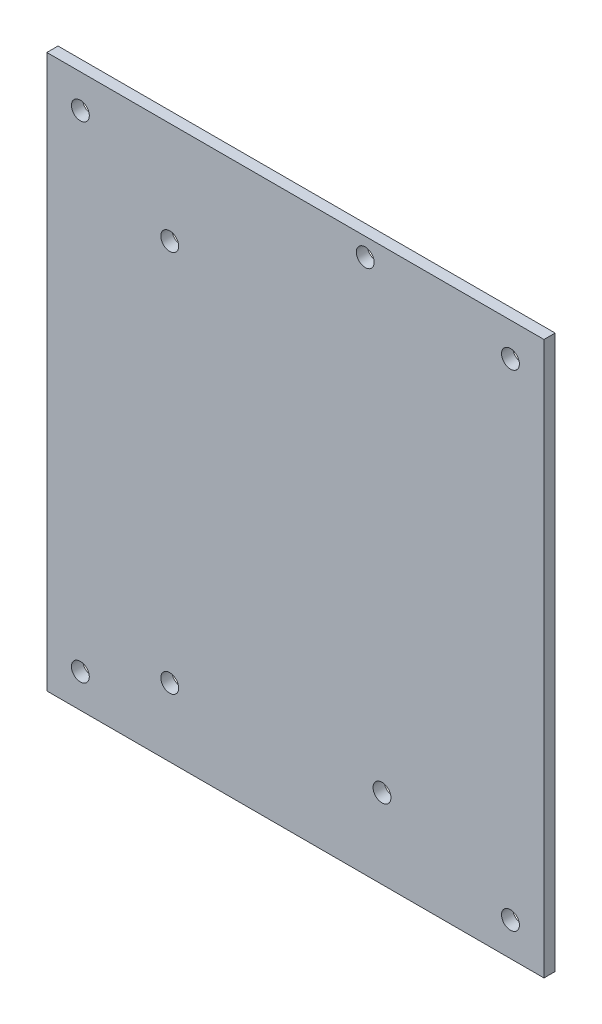
ISO-10303-21;
HEADER;
FILE_DESCRIPTION(('STEP AP214'),'2;1');
FILE_NAME('part.step','',(''),(''),'','','');
FILE_SCHEMA(('AUTOMOTIVE_DESIGN { 1 0 10303 214 1 1 1 1 }'));
ENDSEC;
DATA;
#1=APPLICATION_CONTEXT('core data for automotive mechanical design processes');
#2=APPLICATION_PROTOCOL_DEFINITION('international standard','automotive_design',2000,#1);
#3=PRODUCT_CONTEXT('',#1,'mechanical');
#4=PRODUCT('Part','Part','',(#3));
#5=PRODUCT_RELATED_PRODUCT_CATEGORY('part','',(#4));
#6=PRODUCT_DEFINITION_FORMATION('','',#4);
#7=PRODUCT_DEFINITION_CONTEXT('part definition',#1,'design');
#8=PRODUCT_DEFINITION('design','',#6,#7);
#9=PRODUCT_DEFINITION_SHAPE('','',#8);
#10=(LENGTH_UNIT() NAMED_UNIT(*) SI_UNIT(.MILLI.,.METRE.));
#11=(NAMED_UNIT(*) PLANE_ANGLE_UNIT() SI_UNIT($,.RADIAN.));
#12=(NAMED_UNIT(*) SI_UNIT($,.STERADIAN.) SOLID_ANGLE_UNIT());
#13=UNCERTAINTY_MEASURE_WITH_UNIT(LENGTH_MEASURE(1.E-05),#10,'distance_accuracy_value','');
#14=(GEOMETRIC_REPRESENTATION_CONTEXT(3) GLOBAL_UNCERTAINTY_ASSIGNED_CONTEXT((#13)) GLOBAL_UNIT_ASSIGNED_CONTEXT((#10,
#11,#12)) REPRESENTATION_CONTEXT('',''));
#15=CARTESIAN_POINT('',(0.,0.,0.));
#16=DIRECTION('',(0.,0.,1.));
#17=DIRECTION('',(1.,0.,0.));
#18=AXIS2_PLACEMENT_3D('',#15,#16,#17);
#19=CARTESIAN_POINT('',(-37.8802119802,-33.0379075483988,2.));
#20=DIRECTION('',(1.,0.,0.));
#21=DIRECTION('',(0.,0.,-1.));
#22=AXIS2_PLACEMENT_3D('',#19,#20,#21);
#23=PLANE('',#22);
#24=DIRECTION('',(0.,-1.,0.));
#25=VECTOR('',#24,1.);
#26=CARTESIAN_POINT('',(-37.8802119802,-33.0379075483988,0.));
#27=LINE('',#26,#25);
#28=CARTESIAN_POINT('',(-37.8802119802,65.9620924516012,0.));
#29=VERTEX_POINT('',#28);
#30=CARTESIAN_POINT('',(-37.8802119802,-33.0379075483988,0.));
#31=VERTEX_POINT('',#30);
#32=EDGE_CURVE('E96',#29,#31,#27,.T.);
#33=ORIENTED_EDGE('',*,*,#32,.T.);
#34=DIRECTION('',(0.,0.,-1.));
#35=VECTOR('',#34,1.);
#36=CARTESIAN_POINT('',(-37.8802119802,-33.0379075483988,2.));
#37=LINE('',#36,#35);
#38=CARTESIAN_POINT('',(-37.8802119802,-33.0379075483988,2.));
#39=VERTEX_POINT('',#38);
#40=EDGE_CURVE('E11',#39,#31,#37,.T.);
#41=ORIENTED_EDGE('',*,*,#40,.F.);
#42=DIRECTION('',(0.,-1.,0.));
#43=VECTOR('',#42,1.);
#44=CARTESIAN_POINT('',(-37.8802119802,-33.0379075483988,2.));
#45=LINE('',#44,#43);
#46=CARTESIAN_POINT('',(-37.8802119802,65.9620924516012,2.));
#47=VERTEX_POINT('',#46);
#48=EDGE_CURVE('E84',#47,#39,#45,.T.);
#49=ORIENTED_EDGE('',*,*,#48,.F.);
#50=DIRECTION('',(0.,0.,-1.));
#51=VECTOR('',#50,1.);
#52=CARTESIAN_POINT('',(-37.8802119802,65.9620924516012,2.));
#53=LINE('',#52,#51);
#54=EDGE_CURVE('E92',#47,#29,#53,.T.);
#55=ORIENTED_EDGE('',*,*,#54,.T.);
#56=EDGE_LOOP('',(#33,#41,#49,#55));
#57=FACE_BOUND('',#56,.T.);
#58=ADVANCED_FACE('F33',(#57),#23,.F.);
#59=CARTESIAN_POINT('',(-37.8802119802,-33.0379075483988,2.));
#60=DIRECTION('',(0.,1.,0.));
#61=DIRECTION('',(0.,0.,1.));
#62=AXIS2_PLACEMENT_3D('',#59,#60,#61);
#63=PLANE('',#62);
#64=DIRECTION('',(1.,0.,0.));
#65=VECTOR('',#64,1.);
#66=CARTESIAN_POINT('',(-37.8802119802,-33.0379075483988,0.));
#67=LINE('',#66,#65);
#68=CARTESIAN_POINT('',(51.1197880198,-33.0379075483988,0.));
#69=VERTEX_POINT('',#68);
#70=EDGE_CURVE('E88',#31,#69,#67,.T.);
#71=ORIENTED_EDGE('',*,*,#70,.T.);
#72=DIRECTION('',(0.,0.,-1.));
#73=VECTOR('',#72,1.);
#74=CARTESIAN_POINT('',(51.1197880198,-33.0379075483988,2.));
#75=LINE('',#74,#73);
#76=CARTESIAN_POINT('',(51.1197880198,-33.0379075483988,2.));
#77=VERTEX_POINT('',#76);
#78=EDGE_CURVE('E41',#77,#69,#75,.T.);
#79=ORIENTED_EDGE('',*,*,#78,.F.);
#80=DIRECTION('',(1.,0.,0.));
#81=VECTOR('',#80,1.);
#82=CARTESIAN_POINT('',(-37.8802119802,-33.0379075483988,2.));
#83=LINE('',#82,#81);
#84=EDGE_CURVE('E79',#39,#77,#83,.T.);
#85=ORIENTED_EDGE('',*,*,#84,.F.);
#86=ORIENTED_EDGE('',*,*,#40,.T.);
#87=EDGE_LOOP('',(#71,#79,#85,#86));
#88=FACE_BOUND('',#87,.T.);
#89=ADVANCED_FACE('F87',(#88),#63,.F.);
#90=CARTESIAN_POINT('',(51.1197880198,-33.0379075483988,2.));
#91=DIRECTION('',(-1.,0.,0.));
#92=DIRECTION('',(0.,-1.,0.));
#93=AXIS2_PLACEMENT_3D('',#90,#91,#92);
#94=PLANE('',#93);
#95=DIRECTION('',(0.,1.,0.));
#96=VECTOR('',#95,1.);
#97=CARTESIAN_POINT('',(51.1197880198,-33.0379075483988,0.));
#98=LINE('',#97,#96);
#99=CARTESIAN_POINT('',(51.1197880198,65.9620924516012,0.));
#100=VERTEX_POINT('',#99);
#101=EDGE_CURVE('E66',#69,#100,#98,.T.);
#102=ORIENTED_EDGE('',*,*,#101,.T.);
#103=DIRECTION('',(0.,0.,-1.));
#104=VECTOR('',#103,1.);
#105=CARTESIAN_POINT('',(51.1197880198,65.9620924516012,2.));
#106=LINE('',#105,#104);
#107=CARTESIAN_POINT('',(51.1197880198,65.9620924516012,2.));
#108=VERTEX_POINT('',#107);
#109=EDGE_CURVE('E89',#108,#100,#106,.T.);
#110=ORIENTED_EDGE('',*,*,#109,.F.);
#111=DIRECTION('',(0.,1.,0.));
#112=VECTOR('',#111,1.);
#113=CARTESIAN_POINT('',(51.1197880198,-33.0379075483988,2.));
#114=LINE('',#113,#112);
#115=EDGE_CURVE('E82',#77,#108,#114,.T.);
#116=ORIENTED_EDGE('',*,*,#115,.F.);
#117=ORIENTED_EDGE('',*,*,#78,.T.);
#118=EDGE_LOOP('',(#102,#110,#116,#117));
#119=FACE_BOUND('',#118,.T.);
#120=ADVANCED_FACE('F90',(#119),#94,.F.);
#121=CARTESIAN_POINT('',(-37.8802119802,65.9620924516012,2.));
#122=DIRECTION('',(0.,-1.,0.));
#123=DIRECTION('',(0.,0.,-1.));
#124=AXIS2_PLACEMENT_3D('',#121,#122,#123);
#125=PLANE('',#124);
#126=DIRECTION('',(-1.,0.,0.));
#127=VECTOR('',#126,1.);
#128=CARTESIAN_POINT('',(-37.8802119802,65.9620924516012,0.));
#129=LINE('',#128,#127);
#130=EDGE_CURVE('E72',#100,#29,#129,.T.);
#131=ORIENTED_EDGE('',*,*,#130,.T.);
#132=ORIENTED_EDGE('',*,*,#54,.F.);
#133=DIRECTION('',(-1.,0.,0.));
#134=VECTOR('',#133,1.);
#135=CARTESIAN_POINT('',(-37.8802119802,65.9620924516012,2.));
#136=LINE('',#135,#134);
#137=EDGE_CURVE('E49',#108,#47,#136,.T.);
#138=ORIENTED_EDGE('',*,*,#137,.F.);
#139=ORIENTED_EDGE('',*,*,#109,.T.);
#140=EDGE_LOOP('',(#131,#132,#138,#139));
#141=FACE_BOUND('',#140,.T.);
#142=ADVANCED_FACE('F104',(#141),#125,.F.);
#143=CARTESIAN_POINT('',(0.,0.,2.));
#144=DIRECTION('',(0.,0.,-1.));
#145=DIRECTION('',(-1.,0.,0.));
#146=AXIS2_PLACEMENT_3D('',#143,#144,#145);
#147=PLANE('',#146);
#148=CARTESIAN_POINT('',(-15.8802119802,-20.7879075483988,2.));
#149=DIRECTION('',(0.,0.,1.));
#150=DIRECTION('',(1.,0.,0.));
#151=AXIS2_PLACEMENT_3D('',#148,#149,#150);
#152=CIRCLE('',#151,1.6);
#153=CARTESIAN_POINT('',(-14.2802119802,-20.7879075483988,2.));
#154=VERTEX_POINT('',#153);
#155=EDGE_CURVE('E147',#154,#154,#152,.T.);
#156=ORIENTED_EDGE('',*,*,#155,.F.);
#157=EDGE_LOOP('',(#156));
#158=FACE_BOUND('',#157,.T.);
#159=CARTESIAN_POINT('',(19.1197880198,62.7120924516012,2.));
#160=DIRECTION('',(0.,0.,1.));
#161=DIRECTION('',(1.,0.,0.));
#162=AXIS2_PLACEMENT_3D('',#159,#160,#161);
#163=CIRCLE('',#162,1.6);
#164=CARTESIAN_POINT('',(20.7197880198,62.7120924516012,2.));
#165=VERTEX_POINT('',#164);
#166=EDGE_CURVE('E140',#165,#165,#163,.T.);
#167=ORIENTED_EDGE('',*,*,#166,.F.);
#168=EDGE_LOOP('',(#167));
#169=FACE_BOUND('',#168,.T.);
#170=CARTESIAN_POINT('',(22.1197880198,-18.7879075483988,2.));
#171=DIRECTION('',(0.,0.,1.));
#172=DIRECTION('',(1.,0.,0.));
#173=AXIS2_PLACEMENT_3D('',#170,#171,#172);
#174=CIRCLE('',#173,1.6);
#175=CARTESIAN_POINT('',(23.7197880198,-18.7879075483988,2.));
#176=VERTEX_POINT('',#175);
#177=EDGE_CURVE('E152',#176,#176,#174,.T.);
#178=ORIENTED_EDGE('',*,*,#177,.F.);
#179=EDGE_LOOP('',(#178));
#180=FACE_BOUND('',#179,.T.);
#181=CARTESIAN_POINT('',(-15.8802119802,47.7120924516012,2.));
#182=DIRECTION('',(0.,0.,1.));
#183=DIRECTION('',(1.,0.,0.));
#184=AXIS2_PLACEMENT_3D('',#181,#182,#183);
#185=CIRCLE('',#184,1.6);
#186=CARTESIAN_POINT('',(-14.2802119802,47.7120924516012,2.));
#187=VERTEX_POINT('',#186);
#188=EDGE_CURVE('E134',#187,#187,#185,.T.);
#189=ORIENTED_EDGE('',*,*,#188,.F.);
#190=EDGE_LOOP('',(#189));
#191=FACE_BOUND('',#190,.T.);
#192=CARTESIAN_POINT('',(45.1197880198,59.9620924516012,2.));
#193=DIRECTION('',(0.,0.,1.));
#194=DIRECTION('',(1.,0.,0.));
#195=AXIS2_PLACEMENT_3D('',#192,#193,#194);
#196=CIRCLE('',#195,1.6);
#197=CARTESIAN_POINT('',(46.7197880198,59.9620924516012,2.));
#198=VERTEX_POINT('',#197);
#199=EDGE_CURVE('E123',#198,#198,#196,.T.);
#200=ORIENTED_EDGE('',*,*,#199,.F.);
#201=EDGE_LOOP('',(#200));
#202=FACE_BOUND('',#201,.T.);
#203=CARTESIAN_POINT('',(-31.8802119802,-27.0379075483988,2.));
#204=DIRECTION('',(0.,0.,1.));
#205=DIRECTION('',(1.,0.,0.));
#206=AXIS2_PLACEMENT_3D('',#203,#204,#205);
#207=CIRCLE('',#206,1.6);
#208=CARTESIAN_POINT('',(-30.2802119802,-27.0379075483988,2.));
#209=VERTEX_POINT('',#208);
#210=EDGE_CURVE('E116',#209,#209,#207,.T.);
#211=ORIENTED_EDGE('',*,*,#210,.F.);
#212=EDGE_LOOP('',(#211));
#213=FACE_BOUND('',#212,.T.);
#214=CARTESIAN_POINT('',(45.1197880198,-27.0379075483988,2.));
#215=DIRECTION('',(0.,0.,1.));
#216=DIRECTION('',(1.,0.,0.));
#217=AXIS2_PLACEMENT_3D('',#214,#215,#216);
#218=CIRCLE('',#217,1.6);
#219=CARTESIAN_POINT('',(46.7197880198,-27.0379075483988,2.));
#220=VERTEX_POINT('',#219);
#221=EDGE_CURVE('E128',#220,#220,#218,.T.);
#222=ORIENTED_EDGE('',*,*,#221,.F.);
#223=EDGE_LOOP('',(#222));
#224=FACE_BOUND('',#223,.T.);
#225=CARTESIAN_POINT('',(-31.8802119802,59.9620924516012,2.));
#226=DIRECTION('',(0.,0.,1.));
#227=DIRECTION('',(1.,0.,0.));
#228=AXIS2_PLACEMENT_3D('',#225,#226,#227);
#229=CIRCLE('',#228,1.6);
#230=CARTESIAN_POINT('',(-30.2802119802,59.9620924516012,2.));
#231=VERTEX_POINT('',#230);
#232=EDGE_CURVE('E110',#231,#231,#229,.T.);
#233=ORIENTED_EDGE('',*,*,#232,.F.);
#234=EDGE_LOOP('',(#233));
#235=FACE_BOUND('',#234,.T.);
#236=ORIENTED_EDGE('',*,*,#48,.T.);
#237=ORIENTED_EDGE('',*,*,#84,.T.);
#238=ORIENTED_EDGE('',*,*,#115,.T.);
#239=ORIENTED_EDGE('',*,*,#137,.T.);
#240=EDGE_LOOP('',(#236,#237,#238,#239));
#241=FACE_BOUND('',#240,.T.);
#242=ADVANCED_FACE('F80',(#158,#169,#180,#191,#202,#213,#224,#235,#241),#147,.F.);
#243=CARTESIAN_POINT('',(0.,0.,0.));
#244=DIRECTION('',(0.,0.,-1.));
#245=DIRECTION('',(-1.,0.,0.));
#246=AXIS2_PLACEMENT_3D('',#243,#244,#245);
#247=PLANE('',#246);
#248=CARTESIAN_POINT('',(-15.8802119802,-20.7879075483988,0.));
#249=DIRECTION('',(0.,0.,1.));
#250=DIRECTION('',(1.,0.,0.));
#251=AXIS2_PLACEMENT_3D('',#248,#249,#250);
#252=CIRCLE('',#251,1.6);
#253=CARTESIAN_POINT('',(-14.2802119802,-20.7879075483988,0.));
#254=VERTEX_POINT('',#253);
#255=EDGE_CURVE('E137',#254,#254,#252,.T.);
#256=ORIENTED_EDGE('',*,*,#255,.T.);
#257=EDGE_LOOP('',(#256));
#258=FACE_BOUND('',#257,.T.);
#259=CARTESIAN_POINT('',(19.1197880198,62.7120924516012,0.));
#260=DIRECTION('',(0.,0.,1.));
#261=DIRECTION('',(1.,0.,0.));
#262=AXIS2_PLACEMENT_3D('',#259,#260,#261);
#263=CIRCLE('',#262,1.6);
#264=CARTESIAN_POINT('',(20.7197880198,62.7120924516012,0.));
#265=VERTEX_POINT('',#264);
#266=EDGE_CURVE('E143',#265,#265,#263,.T.);
#267=ORIENTED_EDGE('',*,*,#266,.T.);
#268=EDGE_LOOP('',(#267));
#269=FACE_BOUND('',#268,.T.);
#270=CARTESIAN_POINT('',(22.1197880198,-18.7879075483988,0.));
#271=DIRECTION('',(0.,0.,1.));
#272=DIRECTION('',(1.,0.,0.));
#273=AXIS2_PLACEMENT_3D('',#270,#271,#272);
#274=CIRCLE('',#273,1.6);
#275=CARTESIAN_POINT('',(23.7197880198,-18.7879075483988,0.));
#276=VERTEX_POINT('',#275);
#277=EDGE_CURVE('E144',#276,#276,#274,.T.);
#278=ORIENTED_EDGE('',*,*,#277,.T.);
#279=EDGE_LOOP('',(#278));
#280=FACE_BOUND('',#279,.T.);
#281=CARTESIAN_POINT('',(-15.8802119802,47.7120924516012,0.));
#282=DIRECTION('',(0.,0.,1.));
#283=DIRECTION('',(1.,0.,0.));
#284=AXIS2_PLACEMENT_3D('',#281,#282,#283);
#285=CIRCLE('',#284,1.6);
#286=CARTESIAN_POINT('',(-14.2802119802,47.7120924516012,0.));
#287=VERTEX_POINT('',#286);
#288=EDGE_CURVE('E131',#287,#287,#285,.T.);
#289=ORIENTED_EDGE('',*,*,#288,.T.);
#290=EDGE_LOOP('',(#289));
#291=FACE_BOUND('',#290,.T.);
#292=CARTESIAN_POINT('',(45.1197880198,59.9620924516012,0.));
#293=DIRECTION('',(0.,0.,1.));
#294=DIRECTION('',(1.,0.,0.));
#295=AXIS2_PLACEMENT_3D('',#292,#293,#294);
#296=CIRCLE('',#295,1.6);
#297=CARTESIAN_POINT('',(46.7197880198,59.9620924516012,0.));
#298=VERTEX_POINT('',#297);
#299=EDGE_CURVE('E113',#298,#298,#296,.T.);
#300=ORIENTED_EDGE('',*,*,#299,.T.);
#301=EDGE_LOOP('',(#300));
#302=FACE_BOUND('',#301,.T.);
#303=CARTESIAN_POINT('',(-31.8802119802,-27.0379075483988,0.));
#304=DIRECTION('',(0.,0.,1.));
#305=DIRECTION('',(1.,0.,0.));
#306=AXIS2_PLACEMENT_3D('',#303,#304,#305);
#307=CIRCLE('',#306,1.6);
#308=CARTESIAN_POINT('',(-30.2802119802,-27.0379075483988,0.));
#309=VERTEX_POINT('',#308);
#310=EDGE_CURVE('E119',#309,#309,#307,.T.);
#311=ORIENTED_EDGE('',*,*,#310,.T.);
#312=EDGE_LOOP('',(#311));
#313=FACE_BOUND('',#312,.T.);
#314=CARTESIAN_POINT('',(45.1197880198,-27.0379075483988,0.));
#315=DIRECTION('',(0.,0.,1.));
#316=DIRECTION('',(1.,0.,0.));
#317=AXIS2_PLACEMENT_3D('',#314,#315,#316);
#318=CIRCLE('',#317,1.6);
#319=CARTESIAN_POINT('',(46.7197880198,-27.0379075483988,0.));
#320=VERTEX_POINT('',#319);
#321=EDGE_CURVE('E120',#320,#320,#318,.T.);
#322=ORIENTED_EDGE('',*,*,#321,.T.);
#323=EDGE_LOOP('',(#322));
#324=FACE_BOUND('',#323,.T.);
#325=CARTESIAN_POINT('',(-31.8802119802,59.9620924516012,0.));
#326=DIRECTION('',(0.,0.,1.));
#327=DIRECTION('',(1.,0.,0.));
#328=AXIS2_PLACEMENT_3D('',#325,#326,#327);
#329=CIRCLE('',#328,1.6);
#330=CARTESIAN_POINT('',(-30.2802119802,59.9620924516012,0.));
#331=VERTEX_POINT('',#330);
#332=EDGE_CURVE('E99',#331,#331,#329,.T.);
#333=ORIENTED_EDGE('',*,*,#332,.T.);
#334=EDGE_LOOP('',(#333));
#335=FACE_BOUND('',#334,.T.);
#336=ORIENTED_EDGE('',*,*,#32,.F.);
#337=ORIENTED_EDGE('',*,*,#130,.F.);
#338=ORIENTED_EDGE('',*,*,#101,.F.);
#339=ORIENTED_EDGE('',*,*,#70,.F.);
#340=EDGE_LOOP('',(#336,#337,#338,#339));
#341=FACE_BOUND('',#340,.T.);
#342=ADVANCED_FACE('F107',(#258,#269,#280,#291,#302,#313,#324,#335,#341),#247,.T.);
#343=CARTESIAN_POINT('',(-31.8802119802,59.9620924516012,0.));
#344=DIRECTION('',(0.,0.,1.));
#345=DIRECTION('',(1.,0.,0.));
#346=AXIS2_PLACEMENT_3D('',#343,#344,#345);
#347=CYLINDRICAL_SURFACE('',#346,1.6);
#348=ORIENTED_EDGE('',*,*,#332,.F.);
#349=EDGE_LOOP('',(#348));
#350=FACE_BOUND('',#349,.T.);
#351=ORIENTED_EDGE('',*,*,#232,.T.);
#352=EDGE_LOOP('',(#351));
#353=FACE_BOUND('',#352,.T.);
#354=ADVANCED_FACE('F182',(#350,#353),#347,.F.);
#355=CARTESIAN_POINT('',(45.1197880198,-27.0379075483988,0.));
#356=DIRECTION('',(0.,0.,1.));
#357=DIRECTION('',(1.,0.,0.));
#358=AXIS2_PLACEMENT_3D('',#355,#356,#357);
#359=CYLINDRICAL_SURFACE('',#358,1.6);
#360=ORIENTED_EDGE('',*,*,#321,.F.);
#361=EDGE_LOOP('',(#360));
#362=FACE_BOUND('',#361,.T.);
#363=ORIENTED_EDGE('',*,*,#221,.T.);
#364=EDGE_LOOP('',(#363));
#365=FACE_BOUND('',#364,.T.);
#366=ADVANCED_FACE('F184',(#362,#365),#359,.F.);
#367=CARTESIAN_POINT('',(-31.8802119802,-27.0379075483988,0.));
#368=DIRECTION('',(0.,0.,1.));
#369=DIRECTION('',(1.,0.,0.));
#370=AXIS2_PLACEMENT_3D('',#367,#368,#369);
#371=CYLINDRICAL_SURFACE('',#370,1.6);
#372=ORIENTED_EDGE('',*,*,#310,.F.);
#373=EDGE_LOOP('',(#372));
#374=FACE_BOUND('',#373,.T.);
#375=ORIENTED_EDGE('',*,*,#210,.T.);
#376=EDGE_LOOP('',(#375));
#377=FACE_BOUND('',#376,.T.);
#378=ADVANCED_FACE('F191',(#374,#377),#371,.F.);
#379=CARTESIAN_POINT('',(45.1197880198,59.9620924516012,0.));
#380=DIRECTION('',(0.,0.,1.));
#381=DIRECTION('',(1.,0.,0.));
#382=AXIS2_PLACEMENT_3D('',#379,#380,#381);
#383=CYLINDRICAL_SURFACE('',#382,1.6);
#384=ORIENTED_EDGE('',*,*,#299,.F.);
#385=EDGE_LOOP('',(#384));
#386=FACE_BOUND('',#385,.T.);
#387=ORIENTED_EDGE('',*,*,#199,.T.);
#388=EDGE_LOOP('',(#387));
#389=FACE_BOUND('',#388,.T.);
#390=ADVANCED_FACE('F233',(#386,#389),#383,.F.);
#391=CARTESIAN_POINT('',(-15.8802119802,47.7120924516012,0.));
#392=DIRECTION('',(0.,0.,1.));
#393=DIRECTION('',(1.,0.,0.));
#394=AXIS2_PLACEMENT_3D('',#391,#392,#393);
#395=CYLINDRICAL_SURFACE('',#394,1.6);
#396=ORIENTED_EDGE('',*,*,#288,.F.);
#397=EDGE_LOOP('',(#396));
#398=FACE_BOUND('',#397,.T.);
#399=ORIENTED_EDGE('',*,*,#188,.T.);
#400=EDGE_LOOP('',(#399));
#401=FACE_BOUND('',#400,.T.);
#402=ADVANCED_FACE('F164',(#398,#401),#395,.F.);
#403=CARTESIAN_POINT('',(22.1197880198,-18.7879075483988,0.));
#404=DIRECTION('',(0.,0.,1.));
#405=DIRECTION('',(1.,0.,0.));
#406=AXIS2_PLACEMENT_3D('',#403,#404,#405);
#407=CYLINDRICAL_SURFACE('',#406,1.6);
#408=ORIENTED_EDGE('',*,*,#277,.F.);
#409=EDGE_LOOP('',(#408));
#410=FACE_BOUND('',#409,.T.);
#411=ORIENTED_EDGE('',*,*,#177,.T.);
#412=EDGE_LOOP('',(#411));
#413=FACE_BOUND('',#412,.T.);
#414=ADVANCED_FACE('F160',(#410,#413),#407,.F.);
#415=CARTESIAN_POINT('',(19.1197880198,62.7120924516012,0.));
#416=DIRECTION('',(0.,0.,1.));
#417=DIRECTION('',(1.,0.,0.));
#418=AXIS2_PLACEMENT_3D('',#415,#416,#417);
#419=CYLINDRICAL_SURFACE('',#418,1.6);
#420=ORIENTED_EDGE('',*,*,#266,.F.);
#421=EDGE_LOOP('',(#420));
#422=FACE_BOUND('',#421,.T.);
#423=ORIENTED_EDGE('',*,*,#166,.T.);
#424=EDGE_LOOP('',(#423));
#425=FACE_BOUND('',#424,.T.);
#426=ADVANCED_FACE('F163',(#422,#425),#419,.F.);
#427=CARTESIAN_POINT('',(-15.8802119802,-20.7879075483988,0.));
#428=DIRECTION('',(0.,0.,1.));
#429=DIRECTION('',(1.,0.,0.));
#430=AXIS2_PLACEMENT_3D('',#427,#428,#429);
#431=CYLINDRICAL_SURFACE('',#430,1.6);
#432=ORIENTED_EDGE('',*,*,#255,.F.);
#433=EDGE_LOOP('',(#432));
#434=FACE_BOUND('',#433,.T.);
#435=ORIENTED_EDGE('',*,*,#155,.T.);
#436=EDGE_LOOP('',(#435));
#437=FACE_BOUND('',#436,.T.);
#438=ADVANCED_FACE('F251',(#434,#437),#431,.F.);
#439=CLOSED_SHELL('',(#58,#89,#120,#142,#242,#342,#354,#366,#378,#390,#402,#414,#426,#438));
#440=MANIFOLD_SOLID_BREP('B2',#439);
#441=ADVANCED_BREP_SHAPE_REPRESENTATION('',(#18,#440),#14);
#442=SHAPE_DEFINITION_REPRESENTATION(#9,#441);
ENDSEC;
END-ISO-10303-21;
